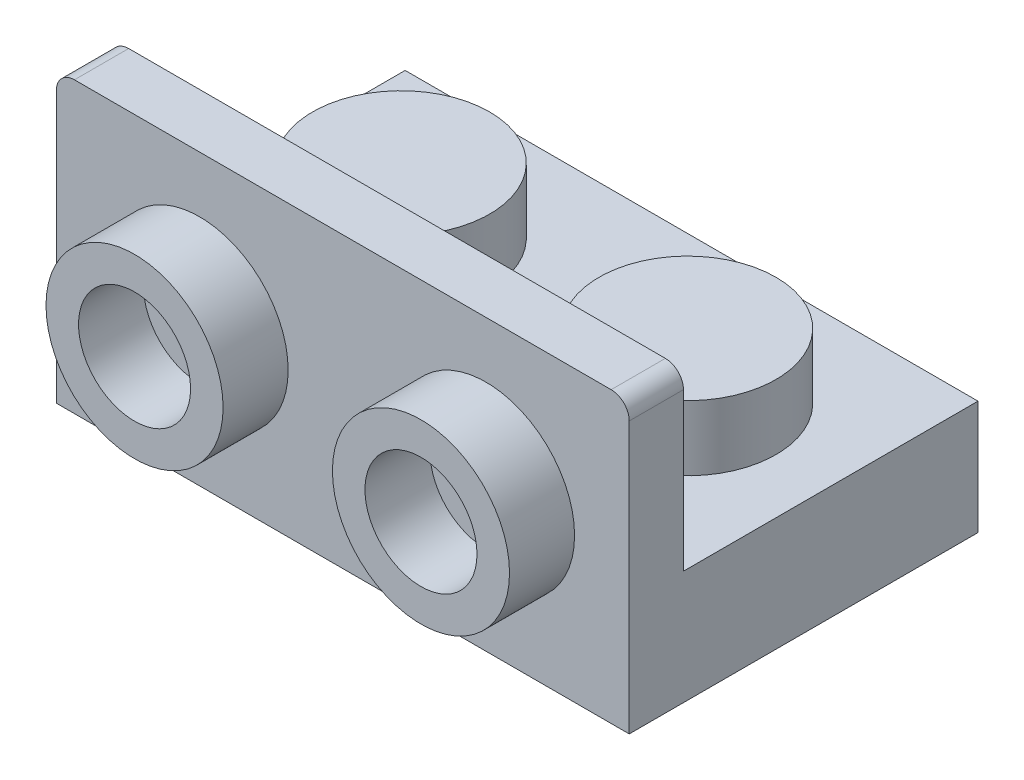
ISO-10303-21;
HEADER;
FILE_DESCRIPTION(('STEP AP214'),'2;1');
FILE_NAME('part.step','',(''),(''),'','','');
FILE_SCHEMA(('AUTOMOTIVE_DESIGN { 1 0 10303 214 1 1 1 1 }'));
ENDSEC;
DATA;
#1=APPLICATION_CONTEXT('core data for automotive mechanical design processes');
#2=APPLICATION_PROTOCOL_DEFINITION('international standard','automotive_design',2000,#1);
#3=PRODUCT_CONTEXT('',#1,'mechanical');
#4=PRODUCT('Part','Part','',(#3));
#5=PRODUCT_RELATED_PRODUCT_CATEGORY('part','',(#4));
#6=PRODUCT_DEFINITION_FORMATION('','',#4);
#7=PRODUCT_DEFINITION_CONTEXT('part definition',#1,'design');
#8=PRODUCT_DEFINITION('design','',#6,#7);
#9=PRODUCT_DEFINITION_SHAPE('','',#8);
#10=(LENGTH_UNIT() NAMED_UNIT(*) SI_UNIT(.MILLI.,.METRE.));
#11=(NAMED_UNIT(*) PLANE_ANGLE_UNIT() SI_UNIT($,.RADIAN.));
#12=(NAMED_UNIT(*) SI_UNIT($,.STERADIAN.) SOLID_ANGLE_UNIT());
#13=UNCERTAINTY_MEASURE_WITH_UNIT(LENGTH_MEASURE(1.E-05),#10,'distance_accuracy_value','');
#14=(GEOMETRIC_REPRESENTATION_CONTEXT(3) GLOBAL_UNCERTAINTY_ASSIGNED_CONTEXT((#13)) GLOBAL_UNIT_ASSIGNED_CONTEXT((#10,
#11,#12)) REPRESENTATION_CONTEXT('',''));
#15=CARTESIAN_POINT('',(0.,0.,0.));
#16=DIRECTION('',(0.,0.,1.));
#17=DIRECTION('',(1.,0.,0.));
#18=AXIS2_PLACEMENT_3D('',#15,#16,#17);
#19=CARTESIAN_POINT('',(-15.85,0.,-9.65));
#20=DIRECTION('',(0.,-1.,0.));
#21=DIRECTION('',(0.,0.,-1.));
#22=AXIS2_PLACEMENT_3D('',#19,#20,#21);
#23=PLANE('',#22);
#24=DIRECTION('',(0.,0.,-1.));
#25=VECTOR('',#24,1.);
#26=CARTESIAN_POINT('',(0.,0.,-9.65));
#27=LINE('',#26,#25);
#28=CARTESIAN_POINT('',(0.,0.,0.));
#29=VERTEX_POINT('',#28);
#30=CARTESIAN_POINT('',(0.,0.,-9.65));
#31=VERTEX_POINT('',#30);
#32=EDGE_CURVE('E201',#29,#31,#27,.T.);
#33=ORIENTED_EDGE('',*,*,#32,.F.);
#34=DIRECTION('',(1.,0.,0.));
#35=VECTOR('',#34,1.);
#36=CARTESIAN_POINT('',(-15.85,0.,0.));
#37=LINE('',#36,#35);
#38=CARTESIAN_POINT('',(-15.85,0.,0.));
#39=VERTEX_POINT('',#38);
#40=EDGE_CURVE('E230',#39,#29,#37,.T.);
#41=ORIENTED_EDGE('',*,*,#40,.F.);
#42=DIRECTION('',(0.,0.,-1.));
#43=VECTOR('',#42,1.);
#44=CARTESIAN_POINT('',(-15.85,0.,-9.65));
#45=LINE('',#44,#43);
#46=CARTESIAN_POINT('',(-15.85,0.,-9.65));
#47=VERTEX_POINT('',#46);
#48=EDGE_CURVE('E204',#39,#47,#45,.T.);
#49=ORIENTED_EDGE('',*,*,#48,.T.);
#50=DIRECTION('',(1.,0.,0.));
#51=VECTOR('',#50,1.);
#52=CARTESIAN_POINT('',(-15.85,0.,-9.65));
#53=LINE('',#52,#51);
#54=EDGE_CURVE('E218',#47,#31,#53,.T.);
#55=ORIENTED_EDGE('',*,*,#54,.T.);
#56=EDGE_LOOP('',(#33,#41,#49,#55));
#57=FACE_BOUND('',#56,.T.);
#58=DIRECTION('',(1.,0.,0.));
#59=VECTOR('',#58,1.);
#60=CARTESIAN_POINT('',(-15.85,0.,-1.5));
#61=LINE('',#60,#59);
#62=CARTESIAN_POINT('',(-14.35,0.,-1.5));
#63=VERTEX_POINT('',#62);
#64=CARTESIAN_POINT('',(-1.5,0.,-1.5));
#65=VERTEX_POINT('',#64);
#66=EDGE_CURVE('E147',#63,#65,#61,.T.);
#67=ORIENTED_EDGE('',*,*,#66,.T.);
#68=DIRECTION('',(0.,0.,-1.));
#69=VECTOR('',#68,1.);
#70=CARTESIAN_POINT('',(-1.5,0.,-9.65));
#71=LINE('',#70,#69);
#72=CARTESIAN_POINT('',(-1.5,0.,-8.15));
#73=VERTEX_POINT('',#72);
#74=EDGE_CURVE('E161',#65,#73,#71,.T.);
#75=ORIENTED_EDGE('',*,*,#74,.T.);
#76=DIRECTION('',(1.,0.,0.));
#77=VECTOR('',#76,1.);
#78=CARTESIAN_POINT('',(-15.85,0.,-8.15));
#79=LINE('',#78,#77);
#80=CARTESIAN_POINT('',(-14.35,0.,-8.15));
#81=VERTEX_POINT('',#80);
#82=EDGE_CURVE('E148',#81,#73,#79,.T.);
#83=ORIENTED_EDGE('',*,*,#82,.F.);
#84=DIRECTION('',(0.,0.,-1.));
#85=VECTOR('',#84,1.);
#86=CARTESIAN_POINT('',(-14.35,0.,-9.65));
#87=LINE('',#86,#85);
#88=EDGE_CURVE('E152',#63,#81,#87,.T.);
#89=ORIENTED_EDGE('',*,*,#88,.F.);
#90=EDGE_LOOP('',(#67,#75,#83,#89));
#91=FACE_BOUND('',#90,.T.);
#92=ADVANCED_FACE('F33',(#57,#91),#23,.T.);
#93=CARTESIAN_POINT('',(-15.85,0.,0.));
#94=DIRECTION('',(0.,0.,1.));
#95=DIRECTION('',(1.,0.,0.));
#96=AXIS2_PLACEMENT_3D('',#93,#94,#95);
#97=PLANE('',#96);
#98=CARTESIAN_POINT('',(-3.9625,4.,0.));
#99=DIRECTION('',(0.,0.,1.));
#100=DIRECTION('',(1.,0.,0.));
#101=AXIS2_PLACEMENT_3D('',#98,#99,#100);
#102=CIRCLE('',#101,2.45);
#103=CARTESIAN_POINT('',(-1.5125,4.,0.));
#104=VERTEX_POINT('',#103);
#105=EDGE_CURVE('E188',#104,#104,#102,.T.);
#106=ORIENTED_EDGE('',*,*,#105,.F.);
#107=EDGE_LOOP('',(#106));
#108=FACE_BOUND('',#107,.T.);
#109=CARTESIAN_POINT('',(-11.8875,4.,0.));
#110=DIRECTION('',(0.,0.,1.));
#111=DIRECTION('',(1.,0.,0.));
#112=AXIS2_PLACEMENT_3D('',#109,#110,#111);
#113=CIRCLE('',#112,2.45);
#114=CARTESIAN_POINT('',(-9.4375,4.,0.));
#115=VERTEX_POINT('',#114);
#116=EDGE_CURVE('E197',#115,#115,#113,.T.);
#117=ORIENTED_EDGE('',*,*,#116,.F.);
#118=EDGE_LOOP('',(#117));
#119=FACE_BOUND('',#118,.T.);
#120=DIRECTION('',(1.,0.,0.));
#121=VECTOR('',#120,1.);
#122=CARTESIAN_POINT('',(-15.85,8.,0.));
#123=LINE('',#122,#121);
#124=CARTESIAN_POINT('',(-15.35,8.,0.));
#125=VERTEX_POINT('',#124);
#126=CARTESIAN_POINT('',(-0.5,8.,0.));
#127=VERTEX_POINT('',#126);
#128=EDGE_CURVE('E234',#125,#127,#123,.T.);
#129=ORIENTED_EDGE('',*,*,#128,.F.);
#130=CARTESIAN_POINT('',(-15.35,7.5,0.));
#131=DIRECTION('',(0.,0.,1.));
#132=DIRECTION('',(1.,0.,0.));
#133=AXIS2_PLACEMENT_3D('',#130,#131,#132);
#134=CIRCLE('',#133,0.5);
#135=CARTESIAN_POINT('',(-15.85,7.5,0.));
#136=VERTEX_POINT('',#135);
#137=EDGE_CURVE('E256',#125,#136,#134,.T.);
#138=ORIENTED_EDGE('',*,*,#137,.T.);
#139=DIRECTION('',(0.,-1.,0.));
#140=VECTOR('',#139,1.);
#141=CARTESIAN_POINT('',(-15.85,0.,0.));
#142=LINE('',#141,#140);
#143=EDGE_CURVE('E216',#136,#39,#142,.T.);
#144=ORIENTED_EDGE('',*,*,#143,.T.);
#145=ORIENTED_EDGE('',*,*,#40,.T.);
#146=DIRECTION('',(0.,-1.,0.));
#147=VECTOR('',#146,1.);
#148=CARTESIAN_POINT('',(0.,0.,0.));
#149=LINE('',#148,#147);
#150=CARTESIAN_POINT('',(0.,7.5,0.));
#151=VERTEX_POINT('',#150);
#152=EDGE_CURVE('E208',#151,#29,#149,.T.);
#153=ORIENTED_EDGE('',*,*,#152,.F.);
#154=CARTESIAN_POINT('',(-0.5,7.5,0.));
#155=DIRECTION('',(0.,0.,1.));
#156=DIRECTION('',(1.,0.,0.));
#157=AXIS2_PLACEMENT_3D('',#154,#155,#156);
#158=CIRCLE('',#157,0.5);
#159=EDGE_CURVE('E254',#151,#127,#158,.T.);
#160=ORIENTED_EDGE('',*,*,#159,.T.);
#161=EDGE_LOOP('',(#129,#138,#144,#145,#153,#160));
#162=FACE_BOUND('',#161,.T.);
#163=ADVANCED_FACE('F270',(#108,#119,#162),#97,.T.);
#164=CARTESIAN_POINT('',(-15.85,8.,0.));
#165=DIRECTION('',(0.,1.,0.));
#166=DIRECTION('',(0.,0.,1.));
#167=AXIS2_PLACEMENT_3D('',#164,#165,#166);
#168=PLANE('',#167);
#169=DIRECTION('',(1.,0.,0.));
#170=VECTOR('',#169,1.);
#171=CARTESIAN_POINT('',(-15.85,8.,-1.5));
#172=LINE('',#171,#170);
#173=CARTESIAN_POINT('',(-15.35,8.,-1.5));
#174=VERTEX_POINT('',#173);
#175=CARTESIAN_POINT('',(-0.5,8.,-1.5));
#176=VERTEX_POINT('',#175);
#177=EDGE_CURVE('E237',#174,#176,#172,.T.);
#178=ORIENTED_EDGE('',*,*,#177,.F.);
#179=DIRECTION('',(0.,0.,1.));
#180=VECTOR('',#179,1.);
#181=CARTESIAN_POINT('',(-15.35,8.,0.));
#182=LINE('',#181,#180);
#183=EDGE_CURVE('E251',#174,#125,#182,.T.);
#184=ORIENTED_EDGE('',*,*,#183,.T.);
#185=ORIENTED_EDGE('',*,*,#128,.T.);
#186=DIRECTION('',(0.,0.,1.));
#187=VECTOR('',#186,1.);
#188=CARTESIAN_POINT('',(-0.5,8.,-1.5));
#189=LINE('',#188,#187);
#190=EDGE_CURVE('E249',#127,#176,#189,.F.);
#191=ORIENTED_EDGE('',*,*,#190,.T.);
#192=EDGE_LOOP('',(#178,#184,#185,#191));
#193=FACE_BOUND('',#192,.T.);
#194=ADVANCED_FACE('F265',(#193),#168,.T.);
#195=CARTESIAN_POINT('',(-15.85,8.,-1.5));
#196=DIRECTION('',(0.,0.,-1.));
#197=DIRECTION('',(0.,1.,0.));
#198=AXIS2_PLACEMENT_3D('',#195,#196,#197);
#199=PLANE('',#198);
#200=DIRECTION('',(0.,1.,0.));
#201=VECTOR('',#200,1.);
#202=CARTESIAN_POINT('',(-15.85,8.,-1.5));
#203=LINE('',#202,#201);
#204=CARTESIAN_POINT('',(-15.85,3.15,-1.5));
#205=VERTEX_POINT('',#204);
#206=CARTESIAN_POINT('',(-15.85,7.5,-1.5));
#207=VERTEX_POINT('',#206);
#208=EDGE_CURVE('E214',#205,#207,#203,.T.);
#209=ORIENTED_EDGE('',*,*,#208,.T.);
#210=CARTESIAN_POINT('',(-15.35,7.5,-1.5));
#211=DIRECTION('',(0.,0.,-1.));
#212=DIRECTION('',(0.,1.,0.));
#213=AXIS2_PLACEMENT_3D('',#210,#211,#212);
#214=CIRCLE('',#213,0.5);
#215=EDGE_CURVE('E41',#207,#174,#214,.T.);
#216=ORIENTED_EDGE('',*,*,#215,.T.);
#217=ORIENTED_EDGE('',*,*,#177,.T.);
#218=CARTESIAN_POINT('',(-0.5,7.5,-1.5));
#219=DIRECTION('',(0.,0.,-1.));
#220=DIRECTION('',(0.,1.,0.));
#221=AXIS2_PLACEMENT_3D('',#218,#219,#220);
#222=CIRCLE('',#221,0.5);
#223=CARTESIAN_POINT('',(0.,7.5,-1.5));
#224=VERTEX_POINT('',#223);
#225=EDGE_CURVE('E48',#176,#224,#222,.T.);
#226=ORIENTED_EDGE('',*,*,#225,.T.);
#227=DIRECTION('',(0.,1.,0.));
#228=VECTOR('',#227,1.);
#229=CARTESIAN_POINT('',(0.,8.,-1.5));
#230=LINE('',#229,#228);
#231=CARTESIAN_POINT('',(0.,3.15,-1.5));
#232=VERTEX_POINT('',#231);
#233=EDGE_CURVE('E227',#232,#224,#230,.T.);
#234=ORIENTED_EDGE('',*,*,#233,.F.);
#235=DIRECTION('',(1.,0.,0.));
#236=VECTOR('',#235,1.);
#237=CARTESIAN_POINT('',(-15.85,3.15,-1.5));
#238=LINE('',#237,#236);
#239=EDGE_CURVE('E239',#205,#232,#238,.T.);
#240=ORIENTED_EDGE('',*,*,#239,.F.);
#241=EDGE_LOOP('',(#209,#216,#217,#226,#234,#240));
#242=FACE_BOUND('',#241,.T.);
#243=ADVANCED_FACE('F261',(#242),#199,.T.);
#244=CARTESIAN_POINT('',(-15.85,3.15,-1.5));
#245=DIRECTION('',(0.,1.,0.));
#246=DIRECTION('',(0.,0.,1.));
#247=AXIS2_PLACEMENT_3D('',#244,#245,#246);
#248=PLANE('',#247);
#249=CARTESIAN_POINT('',(-3.9625,3.15,-5.575));
#250=DIRECTION('',(0.,1.,0.));
#251=DIRECTION('',(0.,0.,1.));
#252=AXIS2_PLACEMENT_3D('',#249,#250,#251);
#253=CIRCLE('',#252,2.45);
#254=CARTESIAN_POINT('',(-3.9625,3.15,-3.125));
#255=VERTEX_POINT('',#254);
#256=EDGE_CURVE('E173',#255,#255,#253,.T.);
#257=ORIENTED_EDGE('',*,*,#256,.F.);
#258=EDGE_LOOP('',(#257));
#259=FACE_BOUND('',#258,.T.);
#260=CARTESIAN_POINT('',(-11.8875,3.15,-5.575));
#261=DIRECTION('',(0.,1.,0.));
#262=DIRECTION('',(0.,0.,1.));
#263=AXIS2_PLACEMENT_3D('',#260,#261,#262);
#264=CIRCLE('',#263,2.45);
#265=CARTESIAN_POINT('',(-11.8875,3.15,-3.125));
#266=VERTEX_POINT('',#265);
#267=EDGE_CURVE('E177',#266,#266,#264,.T.);
#268=ORIENTED_EDGE('',*,*,#267,.F.);
#269=EDGE_LOOP('',(#268));
#270=FACE_BOUND('',#269,.T.);
#271=DIRECTION('',(0.,0.,1.));
#272=VECTOR('',#271,1.);
#273=CARTESIAN_POINT('',(0.,3.15,-1.5));
#274=LINE('',#273,#272);
#275=CARTESIAN_POINT('',(0.,3.15,-9.65));
#276=VERTEX_POINT('',#275);
#277=EDGE_CURVE('E224',#276,#232,#274,.T.);
#278=ORIENTED_EDGE('',*,*,#277,.F.);
#279=DIRECTION('',(1.,0.,0.));
#280=VECTOR('',#279,1.);
#281=CARTESIAN_POINT('',(-15.85,3.15,-9.65));
#282=LINE('',#281,#280);
#283=CARTESIAN_POINT('',(-15.85,3.15,-9.65));
#284=VERTEX_POINT('',#283);
#285=EDGE_CURVE('E241',#284,#276,#282,.T.);
#286=ORIENTED_EDGE('',*,*,#285,.F.);
#287=DIRECTION('',(0.,0.,1.));
#288=VECTOR('',#287,1.);
#289=CARTESIAN_POINT('',(-15.85,3.15,-1.5));
#290=LINE('',#289,#288);
#291=EDGE_CURVE('E211',#284,#205,#290,.T.);
#292=ORIENTED_EDGE('',*,*,#291,.T.);
#293=ORIENTED_EDGE('',*,*,#239,.T.);
#294=EDGE_LOOP('',(#278,#286,#292,#293));
#295=FACE_BOUND('',#294,.T.);
#296=ADVANCED_FACE('F303',(#259,#270,#295),#248,.T.);
#297=CARTESIAN_POINT('',(-15.85,3.15,-9.65));
#298=DIRECTION('',(0.,0.,-1.));
#299=DIRECTION('',(-1.,0.,0.));
#300=AXIS2_PLACEMENT_3D('',#297,#298,#299);
#301=PLANE('',#300);
#302=DIRECTION('',(0.,1.,0.));
#303=VECTOR('',#302,1.);
#304=CARTESIAN_POINT('',(0.,3.15,-9.65));
#305=LINE('',#304,#303);
#306=EDGE_CURVE('E221',#31,#276,#305,.T.);
#307=ORIENTED_EDGE('',*,*,#306,.F.);
#308=ORIENTED_EDGE('',*,*,#54,.F.);
#309=DIRECTION('',(0.,1.,0.));
#310=VECTOR('',#309,1.);
#311=CARTESIAN_POINT('',(-15.85,3.15,-9.65));
#312=LINE('',#311,#310);
#313=EDGE_CURVE('E207',#47,#284,#312,.T.);
#314=ORIENTED_EDGE('',*,*,#313,.T.);
#315=ORIENTED_EDGE('',*,*,#285,.T.);
#316=EDGE_LOOP('',(#307,#308,#314,#315));
#317=FACE_BOUND('',#316,.T.);
#318=ADVANCED_FACE('F300',(#317),#301,.T.);
#319=CARTESIAN_POINT('',(-15.85,0.,0.));
#320=DIRECTION('',(-1.,0.,0.));
#321=DIRECTION('',(0.,0.,1.));
#322=AXIS2_PLACEMENT_3D('',#319,#320,#321);
#323=PLANE('',#322);
#324=ORIENTED_EDGE('',*,*,#143,.F.);
#325=DIRECTION('',(0.,0.,1.));
#326=VECTOR('',#325,1.);
#327=CARTESIAN_POINT('',(-15.85,7.5,0.));
#328=LINE('',#327,#326);
#329=EDGE_CURVE('E56',#136,#207,#328,.F.);
#330=ORIENTED_EDGE('',*,*,#329,.T.);
#331=ORIENTED_EDGE('',*,*,#208,.F.);
#332=ORIENTED_EDGE('',*,*,#291,.F.);
#333=ORIENTED_EDGE('',*,*,#313,.F.);
#334=ORIENTED_EDGE('',*,*,#48,.F.);
#335=EDGE_LOOP('',(#324,#330,#331,#332,#333,#334));
#336=FACE_BOUND('',#335,.T.);
#337=ADVANCED_FACE('F273',(#336),#323,.T.);
#338=CARTESIAN_POINT('',(0.,0.,0.));
#339=DIRECTION('',(-1.,0.,0.));
#340=DIRECTION('',(0.,0.,1.));
#341=AXIS2_PLACEMENT_3D('',#338,#339,#340);
#342=PLANE('',#341);
#343=ORIENTED_EDGE('',*,*,#233,.T.);
#344=DIRECTION('',(0.,0.,1.));
#345=VECTOR('',#344,1.);
#346=CARTESIAN_POINT('',(0.,7.5,0.));
#347=LINE('',#346,#345);
#348=EDGE_CURVE('E11',#224,#151,#347,.T.);
#349=ORIENTED_EDGE('',*,*,#348,.T.);
#350=ORIENTED_EDGE('',*,*,#152,.T.);
#351=ORIENTED_EDGE('',*,*,#32,.T.);
#352=ORIENTED_EDGE('',*,*,#306,.T.);
#353=ORIENTED_EDGE('',*,*,#277,.T.);
#354=EDGE_LOOP('',(#343,#349,#350,#351,#352,#353));
#355=FACE_BOUND('',#354,.T.);
#356=ADVANCED_FACE('F282',(#355),#342,.F.);
#357=CARTESIAN_POINT('',(-11.8875,4.,1.8));
#358=DIRECTION('',(0.,0.,1.));
#359=DIRECTION('',(1.,0.,0.));
#360=AXIS2_PLACEMENT_3D('',#357,#358,#359);
#361=PLANE('',#360);
#362=CARTESIAN_POINT('',(-11.8875,4.,1.8));
#363=DIRECTION('',(0.,0.,1.));
#364=DIRECTION('',(1.,0.,0.));
#365=AXIS2_PLACEMENT_3D('',#362,#363,#364);
#366=CIRCLE('',#365,2.45);
#367=CARTESIAN_POINT('',(-9.4375,4.,1.8));
#368=VERTEX_POINT('',#367);
#369=EDGE_CURVE('E198',#368,#368,#366,.T.);
#370=ORIENTED_EDGE('',*,*,#369,.T.);
#371=EDGE_LOOP('',(#370));
#372=FACE_BOUND('',#371,.T.);
#373=CARTESIAN_POINT('',(-11.8875,4.,1.8));
#374=DIRECTION('',(0.,0.,1.));
#375=DIRECTION('',(1.,0.,0.));
#376=AXIS2_PLACEMENT_3D('',#373,#374,#375);
#377=CIRCLE('',#376,1.55);
#378=CARTESIAN_POINT('',(-10.3375,4.,1.8));
#379=VERTEX_POINT('',#378);
#380=EDGE_CURVE('E192',#379,#379,#377,.T.);
#381=ORIENTED_EDGE('',*,*,#380,.F.);
#382=EDGE_LOOP('',(#381));
#383=FACE_BOUND('',#382,.T.);
#384=ADVANCED_FACE('F314',(#372,#383),#361,.T.);
#385=CARTESIAN_POINT('',(-11.8875,4.,1.8));
#386=DIRECTION('',(0.,0.,-1.));
#387=DIRECTION('',(-1.,0.,0.));
#388=AXIS2_PLACEMENT_3D('',#385,#386,#387);
#389=CYLINDRICAL_SURFACE('',#388,2.45);
#390=ORIENTED_EDGE('',*,*,#369,.F.);
#391=EDGE_LOOP('',(#390));
#392=FACE_BOUND('',#391,.T.);
#393=ORIENTED_EDGE('',*,*,#116,.T.);
#394=EDGE_LOOP('',(#393));
#395=FACE_BOUND('',#394,.T.);
#396=ADVANCED_FACE('F317',(#392,#395),#389,.T.);
#397=CARTESIAN_POINT('',(-11.8875,4.,1.8));
#398=DIRECTION('',(0.,0.,-1.));
#399=DIRECTION('',(-1.,0.,0.));
#400=AXIS2_PLACEMENT_3D('',#397,#398,#399);
#401=CYLINDRICAL_SURFACE('',#400,1.55);
#402=ORIENTED_EDGE('',*,*,#380,.T.);
#403=EDGE_LOOP('',(#402));
#404=FACE_BOUND('',#403,.T.);
#405=CARTESIAN_POINT('',(-11.8875,4.,0.));
#406=DIRECTION('',(0.,0.,1.));
#407=DIRECTION('',(1.,0.,0.));
#408=AXIS2_PLACEMENT_3D('',#405,#406,#407);
#409=CIRCLE('',#408,1.55);
#410=CARTESIAN_POINT('',(-10.3375,4.,0.));
#411=VERTEX_POINT('',#410);
#412=EDGE_CURVE('E233',#411,#411,#409,.F.);
#413=ORIENTED_EDGE('',*,*,#412,.T.);
#414=EDGE_LOOP('',(#413));
#415=FACE_BOUND('',#414,.T.);
#416=ADVANCED_FACE('F320',(#404,#415),#401,.F.);
#417=ORIENTED_EDGE('',*,*,#412,.F.);
#418=EDGE_LOOP('',(#417));
#419=FACE_BOUND('',#418,.T.);
#420=ADVANCED_FACE('F298',(#419),#97,.T.);
#421=CARTESIAN_POINT('',(-3.9625,4.,1.8));
#422=DIRECTION('',(0.,0.,1.));
#423=DIRECTION('',(1.,0.,0.));
#424=AXIS2_PLACEMENT_3D('',#421,#422,#423);
#425=PLANE('',#424);
#426=CARTESIAN_POINT('',(-3.9625,4.,1.8));
#427=DIRECTION('',(0.,0.,1.));
#428=DIRECTION('',(1.,0.,0.));
#429=AXIS2_PLACEMENT_3D('',#426,#427,#428);
#430=CIRCLE('',#429,2.45);
#431=CARTESIAN_POINT('',(-1.5125,4.,1.8));
#432=VERTEX_POINT('',#431);
#433=EDGE_CURVE('E189',#432,#432,#430,.T.);
#434=ORIENTED_EDGE('',*,*,#433,.T.);
#435=EDGE_LOOP('',(#434));
#436=FACE_BOUND('',#435,.T.);
#437=CARTESIAN_POINT('',(-3.9625,4.,1.8));
#438=DIRECTION('',(0.,0.,1.));
#439=DIRECTION('',(1.,0.,0.));
#440=AXIS2_PLACEMENT_3D('',#437,#438,#439);
#441=CIRCLE('',#440,1.55);
#442=CARTESIAN_POINT('',(-2.4125,4.,1.8));
#443=VERTEX_POINT('',#442);
#444=EDGE_CURVE('E183',#443,#443,#441,.T.);
#445=ORIENTED_EDGE('',*,*,#444,.F.);
#446=EDGE_LOOP('',(#445));
#447=FACE_BOUND('',#446,.T.);
#448=ADVANCED_FACE('F332',(#436,#447),#425,.T.);
#449=CARTESIAN_POINT('',(-3.9625,4.,1.8));
#450=DIRECTION('',(0.,0.,-1.));
#451=DIRECTION('',(-1.,0.,0.));
#452=AXIS2_PLACEMENT_3D('',#449,#450,#451);
#453=CYLINDRICAL_SURFACE('',#452,2.45);
#454=ORIENTED_EDGE('',*,*,#433,.F.);
#455=EDGE_LOOP('',(#454));
#456=FACE_BOUND('',#455,.T.);
#457=ORIENTED_EDGE('',*,*,#105,.T.);
#458=EDGE_LOOP('',(#457));
#459=FACE_BOUND('',#458,.T.);
#460=ADVANCED_FACE('F328',(#456,#459),#453,.T.);
#461=CARTESIAN_POINT('',(-3.9625,4.,1.8));
#462=DIRECTION('',(0.,0.,-1.));
#463=DIRECTION('',(-1.,0.,0.));
#464=AXIS2_PLACEMENT_3D('',#461,#462,#463);
#465=CYLINDRICAL_SURFACE('',#464,1.55);
#466=ORIENTED_EDGE('',*,*,#444,.T.);
#467=EDGE_LOOP('',(#466));
#468=FACE_BOUND('',#467,.T.);
#469=CARTESIAN_POINT('',(-3.9625,4.,0.));
#470=DIRECTION('',(0.,0.,1.));
#471=DIRECTION('',(1.,0.,0.));
#472=AXIS2_PLACEMENT_3D('',#469,#470,#471);
#473=CIRCLE('',#472,1.55);
#474=CARTESIAN_POINT('',(-2.4125,4.,0.));
#475=VERTEX_POINT('',#474);
#476=EDGE_CURVE('E246',#475,#475,#473,.F.);
#477=ORIENTED_EDGE('',*,*,#476,.T.);
#478=EDGE_LOOP('',(#477));
#479=FACE_BOUND('',#478,.T.);
#480=ADVANCED_FACE('F331',(#468,#479),#465,.F.);
#481=ORIENTED_EDGE('',*,*,#476,.F.);
#482=EDGE_LOOP('',(#481));
#483=FACE_BOUND('',#482,.T.);
#484=ADVANCED_FACE('F297',(#483),#97,.T.);
#485=CARTESIAN_POINT('',(-11.8875,4.95,-5.575));
#486=DIRECTION('',(0.,-1.,0.));
#487=DIRECTION('',(0.,0.,-1.));
#488=AXIS2_PLACEMENT_3D('',#485,#486,#487);
#489=CYLINDRICAL_SURFACE('',#488,2.45);
#490=CARTESIAN_POINT('',(-11.8875,4.95,-5.575));
#491=DIRECTION('',(0.,1.,0.));
#492=DIRECTION('',(0.,0.,1.));
#493=AXIS2_PLACEMENT_3D('',#490,#491,#492);
#494=CIRCLE('',#493,2.45);
#495=CARTESIAN_POINT('',(-11.8875,4.95,-3.125));
#496=VERTEX_POINT('',#495);
#497=EDGE_CURVE('E180',#496,#496,#494,.T.);
#498=ORIENTED_EDGE('',*,*,#497,.F.);
#499=EDGE_LOOP('',(#498));
#500=FACE_BOUND('',#499,.T.);
#501=ORIENTED_EDGE('',*,*,#267,.T.);
#502=EDGE_LOOP('',(#501));
#503=FACE_BOUND('',#502,.T.);
#504=ADVANCED_FACE('F340',(#500,#503),#489,.T.);
#505=CARTESIAN_POINT('',(-11.8875,4.95,-5.575));
#506=DIRECTION('',(0.,1.,0.));
#507=DIRECTION('',(0.,0.,1.));
#508=AXIS2_PLACEMENT_3D('',#505,#506,#507);
#509=PLANE('',#508);
#510=ORIENTED_EDGE('',*,*,#497,.T.);
#511=EDGE_LOOP('',(#510));
#512=FACE_BOUND('',#511,.T.);
#513=ADVANCED_FACE('F343',(#512),#509,.T.);
#514=CARTESIAN_POINT('',(-3.9625,4.95,-5.575));
#515=DIRECTION('',(0.,-1.,0.));
#516=DIRECTION('',(0.,0.,-1.));
#517=AXIS2_PLACEMENT_3D('',#514,#515,#516);
#518=CYLINDRICAL_SURFACE('',#517,2.45);
#519=CARTESIAN_POINT('',(-3.9625,4.95,-5.575));
#520=DIRECTION('',(0.,1.,0.));
#521=DIRECTION('',(0.,0.,1.));
#522=AXIS2_PLACEMENT_3D('',#519,#520,#521);
#523=CIRCLE('',#522,2.45);
#524=CARTESIAN_POINT('',(-3.9625,4.95,-3.125));
#525=VERTEX_POINT('',#524);
#526=EDGE_CURVE('E174',#525,#525,#523,.T.);
#527=ORIENTED_EDGE('',*,*,#526,.F.);
#528=EDGE_LOOP('',(#527));
#529=FACE_BOUND('',#528,.T.);
#530=ORIENTED_EDGE('',*,*,#256,.T.);
#531=EDGE_LOOP('',(#530));
#532=FACE_BOUND('',#531,.T.);
#533=ADVANCED_FACE('F347',(#529,#532),#518,.T.);
#534=CARTESIAN_POINT('',(-3.9625,4.95,-5.575));
#535=DIRECTION('',(0.,1.,0.));
#536=DIRECTION('',(0.,0.,1.));
#537=AXIS2_PLACEMENT_3D('',#534,#535,#536);
#538=PLANE('',#537);
#539=ORIENTED_EDGE('',*,*,#526,.T.);
#540=EDGE_LOOP('',(#539));
#541=FACE_BOUND('',#540,.T.);
#542=ADVANCED_FACE('F351',(#541),#538,.T.);
#543=CARTESIAN_POINT('',(-15.85,0.,-1.5));
#544=DIRECTION('',(0.,0.,1.));
#545=DIRECTION('',(1.,0.,0.));
#546=AXIS2_PLACEMENT_3D('',#543,#544,#545);
#547=PLANE('',#546);
#548=DIRECTION('',(0.,-1.,0.));
#549=VECTOR('',#548,1.);
#550=CARTESIAN_POINT('',(-1.5,0.,-1.5));
#551=LINE('',#550,#549);
#552=CARTESIAN_POINT('',(-1.5,1.65,-1.5));
#553=VERTEX_POINT('',#552);
#554=EDGE_CURVE('E154',#553,#65,#551,.T.);
#555=ORIENTED_EDGE('',*,*,#554,.T.);
#556=ORIENTED_EDGE('',*,*,#66,.F.);
#557=DIRECTION('',(0.,-1.,0.));
#558=VECTOR('',#557,1.);
#559=CARTESIAN_POINT('',(-14.35,0.,-1.5));
#560=LINE('',#559,#558);
#561=CARTESIAN_POINT('',(-14.35,1.65,-1.5));
#562=VERTEX_POINT('',#561);
#563=EDGE_CURVE('E137',#562,#63,#560,.T.);
#564=ORIENTED_EDGE('',*,*,#563,.F.);
#565=DIRECTION('',(-1.,0.,0.));
#566=VECTOR('',#565,1.);
#567=CARTESIAN_POINT('',(-15.85,1.65,-1.5));
#568=LINE('',#567,#566);
#569=EDGE_CURVE('E132',#553,#562,#568,.T.);
#570=ORIENTED_EDGE('',*,*,#569,.F.);
#571=EDGE_LOOP('',(#555,#556,#564,#570));
#572=FACE_BOUND('',#571,.T.);
#573=ADVANCED_FACE('F355',(#572),#547,.F.);
#574=CARTESIAN_POINT('',(-15.85,1.65,-1.5));
#575=DIRECTION('',(0.,1.,0.));
#576=DIRECTION('',(0.,0.,1.));
#577=AXIS2_PLACEMENT_3D('',#574,#575,#576);
#578=PLANE('',#577);
#579=ORIENTED_EDGE('',*,*,#569,.T.);
#580=DIRECTION('',(0.,0.,1.));
#581=VECTOR('',#580,1.);
#582=CARTESIAN_POINT('',(-14.35,1.65,-1.5));
#583=LINE('',#582,#581);
#584=CARTESIAN_POINT('',(-14.35,1.65,-8.15));
#585=VERTEX_POINT('',#584);
#586=EDGE_CURVE('E125',#585,#562,#583,.T.);
#587=ORIENTED_EDGE('',*,*,#586,.F.);
#588=DIRECTION('',(1.,0.,0.));
#589=VECTOR('',#588,1.);
#590=CARTESIAN_POINT('',(-15.85,1.65,-8.15));
#591=LINE('',#590,#589);
#592=CARTESIAN_POINT('',(-1.5,1.65,-8.15));
#593=VERTEX_POINT('',#592);
#594=EDGE_CURVE('E130',#585,#593,#591,.T.);
#595=ORIENTED_EDGE('',*,*,#594,.T.);
#596=DIRECTION('',(0.,0.,1.));
#597=VECTOR('',#596,1.);
#598=CARTESIAN_POINT('',(-1.5,1.65,-1.5));
#599=LINE('',#598,#597);
#600=EDGE_CURVE('E388',#593,#553,#599,.T.);
#601=ORIENTED_EDGE('',*,*,#600,.T.);
#602=EDGE_LOOP('',(#579,#587,#595,#601));
#603=FACE_BOUND('',#602,.T.);
#604=CARTESIAN_POINT('',(-3.9625,1.65,-5.575));
#605=DIRECTION('',(0.,1.,0.));
#606=DIRECTION('',(0.,0.,1.));
#607=AXIS2_PLACEMENT_3D('',#604,#605,#606);
#608=CIRCLE('',#607,0.950000000000001);
#609=CARTESIAN_POINT('',(-3.9625,1.65,-4.625));
#610=VERTEX_POINT('',#609);
#611=EDGE_CURVE('E166',#610,#610,#608,.T.);
#612=ORIENTED_EDGE('',*,*,#611,.T.);
#613=EDGE_LOOP('',(#612));
#614=FACE_BOUND('',#613,.T.);
#615=CARTESIAN_POINT('',(-11.8875,1.65,-5.575));
#616=DIRECTION('',(0.,1.,0.));
#617=DIRECTION('',(0.,0.,1.));
#618=AXIS2_PLACEMENT_3D('',#615,#616,#617);
#619=CIRCLE('',#618,0.950000000000002);
#620=CARTESIAN_POINT('',(-11.8875,1.65,-4.625));
#621=VERTEX_POINT('',#620);
#622=EDGE_CURVE('E162',#621,#621,#619,.T.);
#623=ORIENTED_EDGE('',*,*,#622,.T.);
#624=EDGE_LOOP('',(#623));
#625=FACE_BOUND('',#624,.T.);
#626=ADVANCED_FACE('F127',(#603,#614,#625),#578,.F.);
#627=CARTESIAN_POINT('',(-15.85,3.15,-8.15));
#628=DIRECTION('',(0.,0.,-1.));
#629=DIRECTION('',(-1.,0.,0.));
#630=AXIS2_PLACEMENT_3D('',#627,#628,#629);
#631=PLANE('',#630);
#632=DIRECTION('',(0.,1.,0.));
#633=VECTOR('',#632,1.);
#634=CARTESIAN_POINT('',(-1.5,3.15,-8.15));
#635=LINE('',#634,#633);
#636=EDGE_CURVE('E146',#73,#593,#635,.T.);
#637=ORIENTED_EDGE('',*,*,#636,.T.);
#638=ORIENTED_EDGE('',*,*,#594,.F.);
#639=DIRECTION('',(0.,1.,0.));
#640=VECTOR('',#639,1.);
#641=CARTESIAN_POINT('',(-14.35,3.15,-8.15));
#642=LINE('',#641,#640);
#643=EDGE_CURVE('E138',#81,#585,#642,.T.);
#644=ORIENTED_EDGE('',*,*,#643,.F.);
#645=ORIENTED_EDGE('',*,*,#82,.T.);
#646=EDGE_LOOP('',(#637,#638,#644,#645));
#647=FACE_BOUND('',#646,.T.);
#648=ADVANCED_FACE('F143',(#647),#631,.F.);
#649=CARTESIAN_POINT('',(-14.35,0.,0.));
#650=DIRECTION('',(-1.,0.,0.));
#651=DIRECTION('',(0.,0.,1.));
#652=AXIS2_PLACEMENT_3D('',#649,#650,#651);
#653=PLANE('',#652);
#654=ORIENTED_EDGE('',*,*,#88,.T.);
#655=ORIENTED_EDGE('',*,*,#643,.T.);
#656=ORIENTED_EDGE('',*,*,#586,.T.);
#657=ORIENTED_EDGE('',*,*,#563,.T.);
#658=EDGE_LOOP('',(#654,#655,#656,#657));
#659=FACE_BOUND('',#658,.T.);
#660=ADVANCED_FACE('F150',(#659),#653,.F.);
#661=CARTESIAN_POINT('',(-1.5,0.,0.));
#662=DIRECTION('',(-1.,0.,0.));
#663=DIRECTION('',(0.,0.,1.));
#664=AXIS2_PLACEMENT_3D('',#661,#662,#663);
#665=PLANE('',#664);
#666=ORIENTED_EDGE('',*,*,#74,.F.);
#667=ORIENTED_EDGE('',*,*,#554,.F.);
#668=ORIENTED_EDGE('',*,*,#600,.F.);
#669=ORIENTED_EDGE('',*,*,#636,.F.);
#670=EDGE_LOOP('',(#666,#667,#668,#669));
#671=FACE_BOUND('',#670,.T.);
#672=ADVANCED_FACE('F371',(#671),#665,.T.);
#673=CARTESIAN_POINT('',(-11.8875,4.95,-5.575));
#674=DIRECTION('',(0.,-1.,0.));
#675=DIRECTION('',(0.,0.,-1.));
#676=AXIS2_PLACEMENT_3D('',#673,#674,#675);
#677=CYLINDRICAL_SURFACE('',#676,0.950000000000002);
#678=CARTESIAN_POINT('',(-11.8875,3.45,-5.575));
#679=DIRECTION('',(0.,1.,0.));
#680=DIRECTION('',(0.,0.,1.));
#681=AXIS2_PLACEMENT_3D('',#678,#679,#680);
#682=CIRCLE('',#681,0.950000000000002);
#683=CARTESIAN_POINT('',(-11.8875,3.45,-4.625));
#684=VERTEX_POINT('',#683);
#685=EDGE_CURVE('E158',#684,#684,#682,.T.);
#686=ORIENTED_EDGE('',*,*,#685,.T.);
#687=EDGE_LOOP('',(#686));
#688=FACE_BOUND('',#687,.T.);
#689=ORIENTED_EDGE('',*,*,#622,.F.);
#690=EDGE_LOOP('',(#689));
#691=FACE_BOUND('',#690,.T.);
#692=ADVANCED_FACE('F367',(#688,#691),#677,.F.);
#693=CARTESIAN_POINT('',(-11.8875,3.45,-5.575));
#694=DIRECTION('',(0.,1.,0.));
#695=DIRECTION('',(0.,0.,1.));
#696=AXIS2_PLACEMENT_3D('',#693,#694,#695);
#697=PLANE('',#696);
#698=ORIENTED_EDGE('',*,*,#685,.F.);
#699=EDGE_LOOP('',(#698));
#700=FACE_BOUND('',#699,.T.);
#701=ADVANCED_FACE('F363',(#700),#697,.F.);
#702=CARTESIAN_POINT('',(-3.9625,4.95,-5.575));
#703=DIRECTION('',(0.,-1.,0.));
#704=DIRECTION('',(0.,0.,-1.));
#705=AXIS2_PLACEMENT_3D('',#702,#703,#704);
#706=CYLINDRICAL_SURFACE('',#705,0.950000000000001);
#707=CARTESIAN_POINT('',(-3.9625,3.45,-5.575));
#708=DIRECTION('',(0.,1.,0.));
#709=DIRECTION('',(0.,0.,1.));
#710=AXIS2_PLACEMENT_3D('',#707,#708,#709);
#711=CIRCLE('',#710,0.950000000000001);
#712=CARTESIAN_POINT('',(-3.9625,3.45,-4.625));
#713=VERTEX_POINT('',#712);
#714=EDGE_CURVE('E163',#713,#713,#711,.T.);
#715=ORIENTED_EDGE('',*,*,#714,.T.);
#716=EDGE_LOOP('',(#715));
#717=FACE_BOUND('',#716,.T.);
#718=ORIENTED_EDGE('',*,*,#611,.F.);
#719=EDGE_LOOP('',(#718));
#720=FACE_BOUND('',#719,.T.);
#721=ADVANCED_FACE('F359',(#717,#720),#706,.F.);
#722=CARTESIAN_POINT('',(-3.9625,3.45,-5.575));
#723=DIRECTION('',(0.,1.,0.));
#724=DIRECTION('',(0.,0.,1.));
#725=AXIS2_PLACEMENT_3D('',#722,#723,#724);
#726=PLANE('',#725);
#727=ORIENTED_EDGE('',*,*,#714,.F.);
#728=EDGE_LOOP('',(#727));
#729=FACE_BOUND('',#728,.T.);
#730=ADVANCED_FACE('F289',(#729),#726,.F.);
#731=CARTESIAN_POINT('',(-15.35,7.5,0.));
#732=DIRECTION('',(0.,0.,1.));
#733=DIRECTION('',(1.,0.,0.));
#734=AXIS2_PLACEMENT_3D('',#731,#732,#733);
#735=CYLINDRICAL_SURFACE('',#734,0.5);
#736=ORIENTED_EDGE('',*,*,#215,.F.);
#737=ORIENTED_EDGE('',*,*,#329,.F.);
#738=ORIENTED_EDGE('',*,*,#137,.F.);
#739=ORIENTED_EDGE('',*,*,#183,.F.);
#740=EDGE_LOOP('',(#736,#737,#738,#739));
#741=FACE_BOUND('',#740,.T.);
#742=ADVANCED_FACE('F268',(#741),#735,.T.);
#743=CARTESIAN_POINT('',(-0.5,7.5,0.));
#744=DIRECTION('',(0.,0.,-1.));
#745=DIRECTION('',(-1.,0.,0.));
#746=AXIS2_PLACEMENT_3D('',#743,#744,#745);
#747=CYLINDRICAL_SURFACE('',#746,0.5);
#748=ORIENTED_EDGE('',*,*,#225,.F.);
#749=ORIENTED_EDGE('',*,*,#190,.F.);
#750=ORIENTED_EDGE('',*,*,#159,.F.);
#751=ORIENTED_EDGE('',*,*,#348,.F.);
#752=EDGE_LOOP('',(#748,#749,#750,#751));
#753=FACE_BOUND('',#752,.T.);
#754=ADVANCED_FACE('F35',(#753),#747,.T.);
#755=CLOSED_SHELL('',(#92,#163,#194,#243,#296,#318,#337,#356,#384,#396,#416,#420,#448,#460,#480,
#484,#504,#513,#533,#542,#573,#626,#648,#660,#672,#692,#701,#721,#730,#742,#754));
#756=MANIFOLD_SOLID_BREP('B2',#755);
#757=ADVANCED_BREP_SHAPE_REPRESENTATION('',(#18,#756),#14);
#758=SHAPE_DEFINITION_REPRESENTATION(#9,#757);
ENDSEC;
END-ISO-10303-21;
